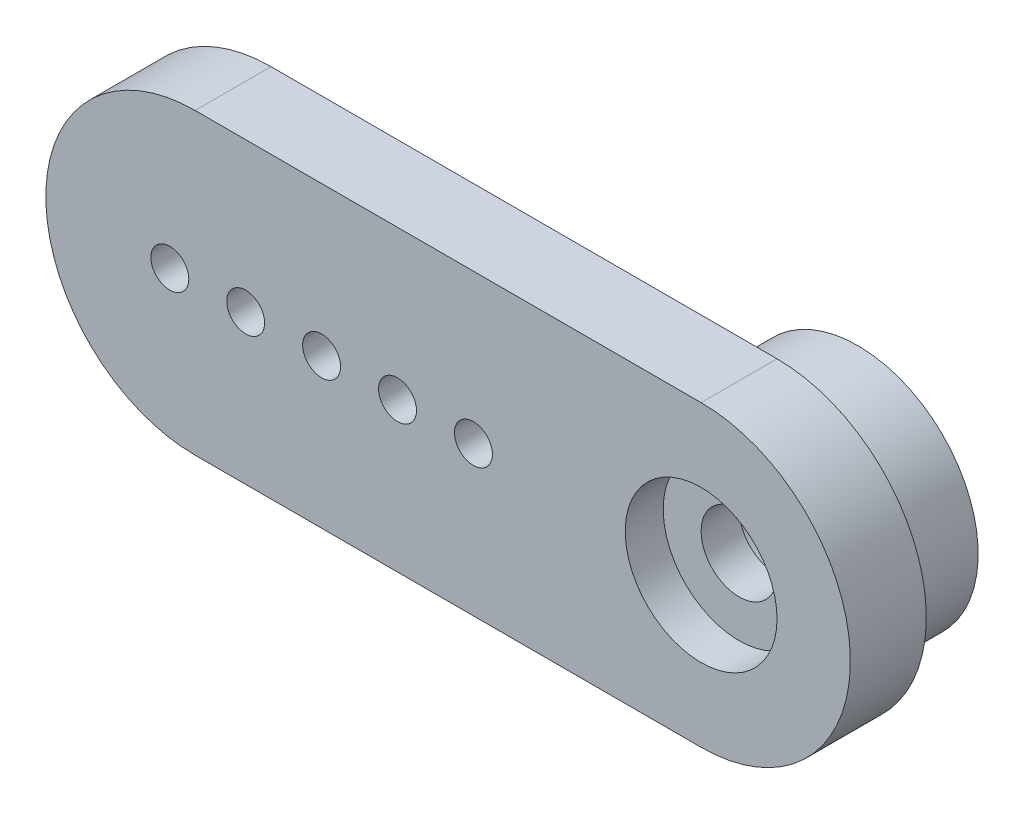
ISO-10303-21;
HEADER;
FILE_DESCRIPTION(('STEP AP214'),'2;1');
FILE_NAME('part.step','',(''),(''),'','','');
FILE_SCHEMA(('AUTOMOTIVE_DESIGN { 1 0 10303 214 1 1 1 1 }'));
ENDSEC;
DATA;
#1=APPLICATION_CONTEXT('core data for automotive mechanical design processes');
#2=APPLICATION_PROTOCOL_DEFINITION('international standard','automotive_design',2000,#1);
#3=PRODUCT_CONTEXT('',#1,'mechanical');
#4=PRODUCT('Part','Part','',(#3));
#5=PRODUCT_RELATED_PRODUCT_CATEGORY('part','',(#4));
#6=PRODUCT_DEFINITION_FORMATION('','',#4);
#7=PRODUCT_DEFINITION_CONTEXT('part definition',#1,'design');
#8=PRODUCT_DEFINITION('design','',#6,#7);
#9=PRODUCT_DEFINITION_SHAPE('','',#8);
#10=(LENGTH_UNIT() NAMED_UNIT(*) SI_UNIT(.MILLI.,.METRE.));
#11=(NAMED_UNIT(*) PLANE_ANGLE_UNIT() SI_UNIT($,.RADIAN.));
#12=(NAMED_UNIT(*) SI_UNIT($,.STERADIAN.) SOLID_ANGLE_UNIT());
#13=UNCERTAINTY_MEASURE_WITH_UNIT(LENGTH_MEASURE(1.E-05),#10,'distance_accuracy_value','');
#14=(GEOMETRIC_REPRESENTATION_CONTEXT(3) GLOBAL_UNCERTAINTY_ASSIGNED_CONTEXT((#13)) GLOBAL_UNIT_ASSIGNED_CONTEXT((#10,
#11,#12)) REPRESENTATION_CONTEXT('',''));
#15=CARTESIAN_POINT('',(0.,0.,0.));
#16=DIRECTION('',(0.,0.,1.));
#17=DIRECTION('',(1.,0.,0.));
#18=AXIS2_PLACEMENT_3D('',#15,#16,#17);
#19=CARTESIAN_POINT('',(0.,0.,-3.));
#20=DIRECTION('',(0.,0.,1.));
#21=DIRECTION('',(1.,0.,0.));
#22=AXIS2_PLACEMENT_3D('',#19,#20,#21);
#23=CYLINDRICAL_SURFACE('',#22,5.9);
#24=CARTESIAN_POINT('',(0.,0.,0.));
#25=DIRECTION('',(0.,0.,1.));
#26=DIRECTION('',(1.,0.,0.));
#27=AXIS2_PLACEMENT_3D('',#24,#25,#26);
#28=CIRCLE('',#27,5.9);
#29=CARTESIAN_POINT('',(0.,-5.9,0.));
#30=VERTEX_POINT('',#29);
#31=CARTESIAN_POINT('',(0.,5.9,0.));
#32=VERTEX_POINT('',#31);
#33=EDGE_CURVE('E100',#30,#32,#28,.T.);
#34=ORIENTED_EDGE('',*,*,#33,.F.);
#35=DIRECTION('',(0.,0.,1.));
#36=VECTOR('',#35,1.);
#37=CARTESIAN_POINT('',(0.,-5.9,-3.));
#38=LINE('',#37,#36);
#39=CARTESIAN_POINT('',(0.,-5.9,-3.));
#40=VERTEX_POINT('',#39);
#41=EDGE_CURVE('E11',#40,#30,#38,.T.);
#42=ORIENTED_EDGE('',*,*,#41,.F.);
#43=CARTESIAN_POINT('',(0.,0.,-3.));
#44=DIRECTION('',(0.,0.,1.));
#45=DIRECTION('',(1.,0.,0.));
#46=AXIS2_PLACEMENT_3D('',#43,#44,#45);
#47=CIRCLE('',#46,5.9);
#48=CARTESIAN_POINT('',(0.,5.9,-3.));
#49=VERTEX_POINT('',#48);
#50=EDGE_CURVE('E93',#40,#49,#47,.T.);
#51=ORIENTED_EDGE('',*,*,#50,.T.);
#52=DIRECTION('',(0.,0.,1.));
#53=VECTOR('',#52,1.);
#54=CARTESIAN_POINT('',(0.,5.9,-3.));
#55=LINE('',#54,#53);
#56=EDGE_CURVE('E76',#49,#32,#55,.T.);
#57=ORIENTED_EDGE('',*,*,#56,.T.);
#58=EDGE_LOOP('',(#34,#42,#51,#57));
#59=FACE_BOUND('',#58,.T.);
#60=ADVANCED_FACE('F33',(#59),#23,.T.);
#61=CARTESIAN_POINT('',(0.,-5.9,-3.));
#62=DIRECTION('',(0.,-1.,0.));
#63=DIRECTION('',(1.,0.,0.));
#64=AXIS2_PLACEMENT_3D('',#61,#62,#63);
#65=PLANE('',#64);
#66=DIRECTION('',(1.,0.,0.));
#67=VECTOR('',#66,1.);
#68=CARTESIAN_POINT('',(0.,-5.9,0.));
#69=LINE('',#68,#67);
#70=CARTESIAN_POINT('',(-20.,-5.9,0.));
#71=VERTEX_POINT('',#70);
#72=EDGE_CURVE('E95',#71,#30,#69,.T.);
#73=ORIENTED_EDGE('',*,*,#72,.F.);
#74=DIRECTION('',(0.,0.,1.));
#75=VECTOR('',#74,1.);
#76=CARTESIAN_POINT('',(-20.,-5.9,-3.));
#77=LINE('',#76,#75);
#78=CARTESIAN_POINT('',(-20.,-5.9,-3.));
#79=VERTEX_POINT('',#78);
#80=EDGE_CURVE('E42',#79,#71,#77,.T.);
#81=ORIENTED_EDGE('',*,*,#80,.F.);
#82=DIRECTION('',(1.,0.,0.));
#83=VECTOR('',#82,1.);
#84=CARTESIAN_POINT('',(0.,-5.9,-3.));
#85=LINE('',#84,#83);
#86=EDGE_CURVE('E90',#79,#40,#85,.T.);
#87=ORIENTED_EDGE('',*,*,#86,.T.);
#88=ORIENTED_EDGE('',*,*,#41,.T.);
#89=EDGE_LOOP('',(#73,#81,#87,#88));
#90=FACE_BOUND('',#89,.T.);
#91=ADVANCED_FACE('F165',(#90),#65,.T.);
#92=CARTESIAN_POINT('',(-20.,0.,-3.));
#93=DIRECTION('',(0.,0.,1.));
#94=DIRECTION('',(1.,0.,0.));
#95=AXIS2_PLACEMENT_3D('',#92,#93,#94);
#96=CYLINDRICAL_SURFACE('',#95,5.9);
#97=CARTESIAN_POINT('',(-20.,0.,0.));
#98=DIRECTION('',(0.,0.,1.));
#99=DIRECTION('',(1.,0.,0.));
#100=AXIS2_PLACEMENT_3D('',#97,#98,#99);
#101=CIRCLE('',#100,5.9);
#102=CARTESIAN_POINT('',(-20.,5.9,0.));
#103=VERTEX_POINT('',#102);
#104=EDGE_CURVE('E84',#103,#71,#101,.T.);
#105=ORIENTED_EDGE('',*,*,#104,.F.);
#106=DIRECTION('',(0.,0.,1.));
#107=VECTOR('',#106,1.);
#108=CARTESIAN_POINT('',(-20.,5.9,-3.));
#109=LINE('',#108,#107);
#110=CARTESIAN_POINT('',(-20.,5.9,-3.));
#111=VERTEX_POINT('',#110);
#112=EDGE_CURVE('E79',#111,#103,#109,.T.);
#113=ORIENTED_EDGE('',*,*,#112,.F.);
#114=CARTESIAN_POINT('',(-20.,0.,-3.));
#115=DIRECTION('',(0.,0.,1.));
#116=DIRECTION('',(1.,0.,0.));
#117=AXIS2_PLACEMENT_3D('',#114,#115,#116);
#118=CIRCLE('',#117,5.9);
#119=EDGE_CURVE('E82',#111,#79,#118,.T.);
#120=ORIENTED_EDGE('',*,*,#119,.T.);
#121=ORIENTED_EDGE('',*,*,#80,.T.);
#122=EDGE_LOOP('',(#105,#113,#120,#121));
#123=FACE_BOUND('',#122,.T.);
#124=ADVANCED_FACE('F81',(#123),#96,.T.);
#125=CARTESIAN_POINT('',(0.,5.9,-3.));
#126=DIRECTION('',(0.,1.,0.));
#127=DIRECTION('',(-1.,0.,0.));
#128=AXIS2_PLACEMENT_3D('',#125,#126,#127);
#129=PLANE('',#128);
#130=DIRECTION('',(-1.,0.,0.));
#131=VECTOR('',#130,1.);
#132=CARTESIAN_POINT('',(0.,5.9,0.));
#133=LINE('',#132,#131);
#134=EDGE_CURVE('E103',#32,#103,#133,.T.);
#135=ORIENTED_EDGE('',*,*,#134,.F.);
#136=ORIENTED_EDGE('',*,*,#56,.F.);
#137=DIRECTION('',(-1.,0.,0.));
#138=VECTOR('',#137,1.);
#139=CARTESIAN_POINT('',(0.,5.9,-3.));
#140=LINE('',#139,#138);
#141=EDGE_CURVE('E89',#49,#111,#140,.T.);
#142=ORIENTED_EDGE('',*,*,#141,.T.);
#143=ORIENTED_EDGE('',*,*,#112,.T.);
#144=EDGE_LOOP('',(#135,#136,#142,#143));
#145=FACE_BOUND('',#144,.T.);
#146=ADVANCED_FACE('F92',(#145),#129,.T.);
#147=CARTESIAN_POINT('',(0.,0.,-3.));
#148=DIRECTION('',(0.,0.,1.));
#149=DIRECTION('',(1.,0.,0.));
#150=AXIS2_PLACEMENT_3D('',#147,#148,#149);
#151=PLANE('',#150);
#152=CARTESIAN_POINT('',(0.,0.,-3.));
#153=DIRECTION('',(0.,0.,1.));
#154=DIRECTION('',(1.,0.,0.));
#155=AXIS2_PLACEMENT_3D('',#152,#153,#154);
#156=CIRCLE('',#155,4.75);
#157=CARTESIAN_POINT('',(4.75,0.,-3.));
#158=VERTEX_POINT('',#157);
#159=EDGE_CURVE('E36',#158,#158,#156,.T.);
#160=ORIENTED_EDGE('',*,*,#159,.T.);
#161=EDGE_LOOP('',(#160));
#162=FACE_BOUND('',#161,.T.);
#163=CARTESIAN_POINT('',(-8.99999999999999,0.,-3.));
#164=DIRECTION('',(0.,0.,1.));
#165=DIRECTION('',(1.,0.,0.));
#166=AXIS2_PLACEMENT_3D('',#163,#164,#165);
#167=CIRCLE('',#166,0.749999999999998);
#168=CARTESIAN_POINT('',(-8.24999999999999,0.,-3.));
#169=VERTEX_POINT('',#168);
#170=EDGE_CURVE('E127',#169,#169,#167,.T.);
#171=ORIENTED_EDGE('',*,*,#170,.T.);
#172=EDGE_LOOP('',(#171));
#173=FACE_BOUND('',#172,.T.);
#174=CARTESIAN_POINT('',(-12.,0.,-3.));
#175=DIRECTION('',(0.,0.,1.));
#176=DIRECTION('',(1.,0.,0.));
#177=AXIS2_PLACEMENT_3D('',#174,#175,#176);
#178=CIRCLE('',#177,0.749999999999998);
#179=CARTESIAN_POINT('',(-11.25,0.,-3.));
#180=VERTEX_POINT('',#179);
#181=EDGE_CURVE('E133',#180,#180,#178,.T.);
#182=ORIENTED_EDGE('',*,*,#181,.T.);
#183=EDGE_LOOP('',(#182));
#184=FACE_BOUND('',#183,.T.);
#185=CARTESIAN_POINT('',(-15.,0.,-3.));
#186=DIRECTION('',(0.,0.,1.));
#187=DIRECTION('',(1.,0.,0.));
#188=AXIS2_PLACEMENT_3D('',#185,#186,#187);
#189=CIRCLE('',#188,0.749999999999998);
#190=CARTESIAN_POINT('',(-14.25,0.,-3.));
#191=VERTEX_POINT('',#190);
#192=EDGE_CURVE('E139',#191,#191,#189,.T.);
#193=ORIENTED_EDGE('',*,*,#192,.T.);
#194=EDGE_LOOP('',(#193));
#195=FACE_BOUND('',#194,.T.);
#196=CARTESIAN_POINT('',(-18.,0.,-3.));
#197=DIRECTION('',(0.,0.,1.));
#198=DIRECTION('',(1.,0.,0.));
#199=AXIS2_PLACEMENT_3D('',#196,#197,#198);
#200=CIRCLE('',#199,0.750000000000013);
#201=CARTESIAN_POINT('',(-17.25,0.,-3.));
#202=VERTEX_POINT('',#201);
#203=EDGE_CURVE('E145',#202,#202,#200,.T.);
#204=ORIENTED_EDGE('',*,*,#203,.T.);
#205=EDGE_LOOP('',(#204));
#206=FACE_BOUND('',#205,.T.);
#207=CARTESIAN_POINT('',(-21.,0.,-3.));
#208=DIRECTION('',(0.,0.,1.));
#209=DIRECTION('',(1.,0.,0.));
#210=AXIS2_PLACEMENT_3D('',#207,#208,#209);
#211=CIRCLE('',#210,0.750000000000013);
#212=CARTESIAN_POINT('',(-20.25,0.,-3.));
#213=VERTEX_POINT('',#212);
#214=EDGE_CURVE('E151',#213,#213,#211,.T.);
#215=ORIENTED_EDGE('',*,*,#214,.T.);
#216=EDGE_LOOP('',(#215));
#217=FACE_BOUND('',#216,.T.);
#218=ORIENTED_EDGE('',*,*,#50,.F.);
#219=ORIENTED_EDGE('',*,*,#86,.F.);
#220=ORIENTED_EDGE('',*,*,#119,.F.);
#221=ORIENTED_EDGE('',*,*,#141,.F.);
#222=EDGE_LOOP('',(#218,#219,#220,#221));
#223=FACE_BOUND('',#222,.T.);
#224=ADVANCED_FACE('F88',(#162,#173,#184,#195,#206,#217,#223),#151,.F.);
#225=CARTESIAN_POINT('',(0.,0.,0.));
#226=DIRECTION('',(0.,0.,1.));
#227=DIRECTION('',(1.,0.,0.));
#228=AXIS2_PLACEMENT_3D('',#225,#226,#227);
#229=PLANE('',#228);
#230=CARTESIAN_POINT('',(-8.99999999999999,0.,0.));
#231=DIRECTION('',(0.,0.,1.));
#232=DIRECTION('',(1.,0.,0.));
#233=AXIS2_PLACEMENT_3D('',#230,#231,#232);
#234=CIRCLE('',#233,0.749999999999998);
#235=CARTESIAN_POINT('',(-8.24999999999999,0.,0.));
#236=VERTEX_POINT('',#235);
#237=EDGE_CURVE('E116',#236,#236,#234,.T.);
#238=ORIENTED_EDGE('',*,*,#237,.F.);
#239=EDGE_LOOP('',(#238));
#240=FACE_BOUND('',#239,.T.);
#241=CARTESIAN_POINT('',(-12.,0.,0.));
#242=DIRECTION('',(0.,0.,1.));
#243=DIRECTION('',(1.,0.,0.));
#244=AXIS2_PLACEMENT_3D('',#241,#242,#243);
#245=CIRCLE('',#244,0.749999999999998);
#246=CARTESIAN_POINT('',(-11.25,0.,0.));
#247=VERTEX_POINT('',#246);
#248=EDGE_CURVE('E130',#247,#247,#245,.T.);
#249=ORIENTED_EDGE('',*,*,#248,.F.);
#250=EDGE_LOOP('',(#249));
#251=FACE_BOUND('',#250,.T.);
#252=CARTESIAN_POINT('',(-15.,0.,0.));
#253=DIRECTION('',(0.,0.,1.));
#254=DIRECTION('',(1.,0.,0.));
#255=AXIS2_PLACEMENT_3D('',#252,#253,#254);
#256=CIRCLE('',#255,0.749999999999998);
#257=CARTESIAN_POINT('',(-14.25,0.,0.));
#258=VERTEX_POINT('',#257);
#259=EDGE_CURVE('E136',#258,#258,#256,.T.);
#260=ORIENTED_EDGE('',*,*,#259,.F.);
#261=EDGE_LOOP('',(#260));
#262=FACE_BOUND('',#261,.T.);
#263=CARTESIAN_POINT('',(-18.,0.,0.));
#264=DIRECTION('',(0.,0.,1.));
#265=DIRECTION('',(1.,0.,0.));
#266=AXIS2_PLACEMENT_3D('',#263,#264,#265);
#267=CIRCLE('',#266,0.750000000000013);
#268=CARTESIAN_POINT('',(-17.25,0.,0.));
#269=VERTEX_POINT('',#268);
#270=EDGE_CURVE('E142',#269,#269,#267,.T.);
#271=ORIENTED_EDGE('',*,*,#270,.F.);
#272=EDGE_LOOP('',(#271));
#273=FACE_BOUND('',#272,.T.);
#274=CARTESIAN_POINT('',(-21.,0.,0.));
#275=DIRECTION('',(0.,0.,1.));
#276=DIRECTION('',(1.,0.,0.));
#277=AXIS2_PLACEMENT_3D('',#274,#275,#276);
#278=CIRCLE('',#277,0.750000000000013);
#279=CARTESIAN_POINT('',(-20.25,0.,0.));
#280=VERTEX_POINT('',#279);
#281=EDGE_CURVE('E148',#280,#280,#278,.T.);
#282=ORIENTED_EDGE('',*,*,#281,.F.);
#283=EDGE_LOOP('',(#282));
#284=FACE_BOUND('',#283,.T.);
#285=CARTESIAN_POINT('',(0.,0.,0.));
#286=DIRECTION('',(0.,0.,1.));
#287=DIRECTION('',(1.,0.,0.));
#288=AXIS2_PLACEMENT_3D('',#285,#286,#287);
#289=CIRCLE('',#288,3.);
#290=CARTESIAN_POINT('',(3.,0.,0.));
#291=VERTEX_POINT('',#290);
#292=EDGE_CURVE('E104',#291,#291,#289,.T.);
#293=ORIENTED_EDGE('',*,*,#292,.F.);
#294=EDGE_LOOP('',(#293));
#295=FACE_BOUND('',#294,.T.);
#296=ORIENTED_EDGE('',*,*,#33,.T.);
#297=ORIENTED_EDGE('',*,*,#134,.T.);
#298=ORIENTED_EDGE('',*,*,#104,.T.);
#299=ORIENTED_EDGE('',*,*,#72,.T.);
#300=EDGE_LOOP('',(#296,#297,#298,#299));
#301=FACE_BOUND('',#300,.T.);
#302=ADVANCED_FACE('F160',(#240,#251,#262,#273,#284,#295,#301),#229,.T.);
#303=CARTESIAN_POINT('',(0.,0.,-3.));
#304=DIRECTION('',(0.,0.,1.));
#305=DIRECTION('',(1.,0.,0.));
#306=AXIS2_PLACEMENT_3D('',#303,#304,#305);
#307=CYLINDRICAL_SURFACE('',#306,3.);
#308=CARTESIAN_POINT('',(0.,0.,-1.5));
#309=DIRECTION('',(0.,0.,1.));
#310=DIRECTION('',(1.,0.,0.));
#311=AXIS2_PLACEMENT_3D('',#308,#309,#310);
#312=CIRCLE('',#311,3.);
#313=CARTESIAN_POINT('',(3.,0.,-1.5));
#314=VERTEX_POINT('',#313);
#315=EDGE_CURVE('E110',#314,#314,#312,.F.);
#316=ORIENTED_EDGE('',*,*,#315,.T.);
#317=EDGE_LOOP('',(#316));
#318=FACE_BOUND('',#317,.T.);
#319=ORIENTED_EDGE('',*,*,#292,.T.);
#320=EDGE_LOOP('',(#319));
#321=FACE_BOUND('',#320,.T.);
#322=ADVANCED_FACE('F158',(#318,#321),#307,.F.);
#323=CARTESIAN_POINT('',(-21.,0.,-3.));
#324=DIRECTION('',(0.,0.,1.));
#325=DIRECTION('',(1.,0.,0.));
#326=AXIS2_PLACEMENT_3D('',#323,#324,#325);
#327=CYLINDRICAL_SURFACE('',#326,0.750000000000013);
#328=ORIENTED_EDGE('',*,*,#214,.F.);
#329=EDGE_LOOP('',(#328));
#330=FACE_BOUND('',#329,.T.);
#331=ORIENTED_EDGE('',*,*,#281,.T.);
#332=EDGE_LOOP('',(#331));
#333=FACE_BOUND('',#332,.T.);
#334=ADVANCED_FACE('F185',(#330,#333),#327,.F.);
#335=CARTESIAN_POINT('',(-18.,0.,-3.));
#336=DIRECTION('',(0.,0.,1.));
#337=DIRECTION('',(1.,0.,0.));
#338=AXIS2_PLACEMENT_3D('',#335,#336,#337);
#339=CYLINDRICAL_SURFACE('',#338,0.750000000000013);
#340=ORIENTED_EDGE('',*,*,#203,.F.);
#341=EDGE_LOOP('',(#340));
#342=FACE_BOUND('',#341,.T.);
#343=ORIENTED_EDGE('',*,*,#270,.T.);
#344=EDGE_LOOP('',(#343));
#345=FACE_BOUND('',#344,.T.);
#346=ADVANCED_FACE('F188',(#342,#345),#339,.F.);
#347=CARTESIAN_POINT('',(-15.,0.,-3.));
#348=DIRECTION('',(0.,0.,1.));
#349=DIRECTION('',(1.,0.,0.));
#350=AXIS2_PLACEMENT_3D('',#347,#348,#349);
#351=CYLINDRICAL_SURFACE('',#350,0.749999999999998);
#352=ORIENTED_EDGE('',*,*,#192,.F.);
#353=EDGE_LOOP('',(#352));
#354=FACE_BOUND('',#353,.T.);
#355=ORIENTED_EDGE('',*,*,#259,.T.);
#356=EDGE_LOOP('',(#355));
#357=FACE_BOUND('',#356,.T.);
#358=ADVANCED_FACE('F192',(#354,#357),#351,.F.);
#359=CARTESIAN_POINT('',(-12.,0.,-3.));
#360=DIRECTION('',(0.,0.,1.));
#361=DIRECTION('',(1.,0.,0.));
#362=AXIS2_PLACEMENT_3D('',#359,#360,#361);
#363=CYLINDRICAL_SURFACE('',#362,0.749999999999998);
#364=ORIENTED_EDGE('',*,*,#181,.F.);
#365=EDGE_LOOP('',(#364));
#366=FACE_BOUND('',#365,.T.);
#367=ORIENTED_EDGE('',*,*,#248,.T.);
#368=EDGE_LOOP('',(#367));
#369=FACE_BOUND('',#368,.T.);
#370=ADVANCED_FACE('F196',(#366,#369),#363,.F.);
#371=CARTESIAN_POINT('',(-8.99999999999999,0.,-3.));
#372=DIRECTION('',(0.,0.,1.));
#373=DIRECTION('',(1.,0.,0.));
#374=AXIS2_PLACEMENT_3D('',#371,#372,#373);
#375=CYLINDRICAL_SURFACE('',#374,0.749999999999998);
#376=ORIENTED_EDGE('',*,*,#170,.F.);
#377=EDGE_LOOP('',(#376));
#378=FACE_BOUND('',#377,.T.);
#379=ORIENTED_EDGE('',*,*,#237,.T.);
#380=EDGE_LOOP('',(#379));
#381=FACE_BOUND('',#380,.T.);
#382=ADVANCED_FACE('F200',(#378,#381),#375,.F.);
#383=CARTESIAN_POINT('',(0.,0.,-6.2));
#384=DIRECTION('',(0.,0.,-1.));
#385=DIRECTION('',(-1.,0.,0.));
#386=AXIS2_PLACEMENT_3D('',#383,#384,#385);
#387=CYLINDRICAL_SURFACE('',#386,4.75);
#388=CARTESIAN_POINT('',(0.,0.,-6.2));
#389=DIRECTION('',(0.,0.,-1.));
#390=DIRECTION('',(-1.,0.,0.));
#391=AXIS2_PLACEMENT_3D('',#388,#389,#390);
#392=CIRCLE('',#391,4.75);
#393=CARTESIAN_POINT('',(-4.75,0.,-6.2));
#394=VERTEX_POINT('',#393);
#395=EDGE_CURVE('E232',#394,#394,#392,.T.);
#396=ORIENTED_EDGE('',*,*,#395,.F.);
#397=EDGE_LOOP('',(#396));
#398=FACE_BOUND('',#397,.T.);
#399=ORIENTED_EDGE('',*,*,#159,.F.);
#400=EDGE_LOOP('',(#399));
#401=FACE_BOUND('',#400,.T.);
#402=ADVANCED_FACE('F204',(#398,#401),#387,.T.);
#403=CARTESIAN_POINT('',(-4.75,0.,-1.5));
#404=DIRECTION('',(0.,0.,1.));
#405=DIRECTION('',(1.,0.,0.));
#406=AXIS2_PLACEMENT_3D('',#403,#404,#405);
#407=PLANE('',#406);
#408=CARTESIAN_POINT('',(0.,0.,-1.5));
#409=DIRECTION('',(0.,0.,-1.));
#410=DIRECTION('',(-1.,0.,0.));
#411=AXIS2_PLACEMENT_3D('',#408,#409,#410);
#412=CIRCLE('',#411,1.5);
#413=CARTESIAN_POINT('',(-1.5,0.,-1.5));
#414=VERTEX_POINT('',#413);
#415=EDGE_CURVE('E112',#414,#414,#412,.T.);
#416=ORIENTED_EDGE('',*,*,#415,.T.);
#417=EDGE_LOOP('',(#416));
#418=FACE_BOUND('',#417,.T.);
#419=ORIENTED_EDGE('',*,*,#315,.F.);
#420=EDGE_LOOP('',(#419));
#421=FACE_BOUND('',#420,.T.);
#422=ADVANCED_FACE('F208',(#418,#421),#407,.T.);
#423=CARTESIAN_POINT('',(0.,0.,-6.2));
#424=DIRECTION('',(0.,0.,-1.));
#425=DIRECTION('',(-1.,0.,0.));
#426=AXIS2_PLACEMENT_3D('',#423,#424,#425);
#427=CYLINDRICAL_SURFACE('',#426,1.5);
#428=CARTESIAN_POINT('',(0.,0.,-3.));
#429=DIRECTION('',(0.,0.,-1.));
#430=DIRECTION('',(-1.,0.,0.));
#431=AXIS2_PLACEMENT_3D('',#428,#429,#430);
#432=CIRCLE('',#431,1.5);
#433=CARTESIAN_POINT('',(-1.5,0.,-3.));
#434=VERTEX_POINT('',#433);
#435=EDGE_CURVE('E118',#434,#434,#432,.T.);
#436=ORIENTED_EDGE('',*,*,#435,.T.);
#437=EDGE_LOOP('',(#436));
#438=FACE_BOUND('',#437,.T.);
#439=ORIENTED_EDGE('',*,*,#415,.F.);
#440=EDGE_LOOP('',(#439));
#441=FACE_BOUND('',#440,.T.);
#442=ADVANCED_FACE('F212',(#438,#441),#427,.F.);
#443=CARTESIAN_POINT('',(-1.5,0.,-3.));
#444=DIRECTION('',(0.,0.,-1.));
#445=DIRECTION('',(-1.,0.,0.));
#446=AXIS2_PLACEMENT_3D('',#443,#444,#445);
#447=PLANE('',#446);
#448=CARTESIAN_POINT('',(0.,0.,-3.));
#449=DIRECTION('',(0.,0.,-1.));
#450=DIRECTION('',(-1.,0.,0.));
#451=AXIS2_PLACEMENT_3D('',#448,#449,#450);
#452=CIRCLE('',#451,2.75);
#453=CARTESIAN_POINT('',(-2.75,0.,-3.));
#454=VERTEX_POINT('',#453);
#455=EDGE_CURVE('E123',#454,#454,#452,.T.);
#456=ORIENTED_EDGE('',*,*,#455,.T.);
#457=EDGE_LOOP('',(#456));
#458=FACE_BOUND('',#457,.T.);
#459=ORIENTED_EDGE('',*,*,#435,.F.);
#460=EDGE_LOOP('',(#459));
#461=FACE_BOUND('',#460,.T.);
#462=ADVANCED_FACE('F215',(#458,#461),#447,.T.);
#463=CARTESIAN_POINT('',(0.,0.,-6.2));
#464=DIRECTION('',(0.,0.,-1.));
#465=DIRECTION('',(-1.,0.,0.));
#466=AXIS2_PLACEMENT_3D('',#463,#464,#465);
#467=CYLINDRICAL_SURFACE('',#466,2.75);
#468=CARTESIAN_POINT('',(0.,0.,-6.2));
#469=DIRECTION('',(0.,0.,-1.));
#470=DIRECTION('',(-1.,0.,0.));
#471=AXIS2_PLACEMENT_3D('',#468,#469,#470);
#472=CIRCLE('',#471,2.75);
#473=CARTESIAN_POINT('',(-2.75,0.,-6.2));
#474=VERTEX_POINT('',#473);
#475=EDGE_CURVE('E235',#474,#474,#472,.T.);
#476=ORIENTED_EDGE('',*,*,#475,.T.);
#477=EDGE_LOOP('',(#476));
#478=FACE_BOUND('',#477,.T.);
#479=ORIENTED_EDGE('',*,*,#455,.F.);
#480=EDGE_LOOP('',(#479));
#481=FACE_BOUND('',#480,.T.);
#482=ADVANCED_FACE('F219',(#478,#481),#467,.F.);
#483=CARTESIAN_POINT('',(-4.75,0.,-6.2));
#484=DIRECTION('',(0.,0.,-1.));
#485=DIRECTION('',(-1.,0.,0.));
#486=AXIS2_PLACEMENT_3D('',#483,#484,#485);
#487=PLANE('',#486);
#488=ORIENTED_EDGE('',*,*,#395,.T.);
#489=EDGE_LOOP('',(#488));
#490=FACE_BOUND('',#489,.T.);
#491=ORIENTED_EDGE('',*,*,#475,.F.);
#492=EDGE_LOOP('',(#491));
#493=FACE_BOUND('',#492,.T.);
#494=ADVANCED_FACE('F223',(#490,#493),#487,.T.);
#495=CLOSED_SHELL('',(#60,#91,#124,#146,#224,#302,#322,#334,#346,#358,#370,#382,#402,#422,#442,
#462,#482,#494));
#496=MANIFOLD_SOLID_BREP('B2',#495);
#497=ADVANCED_BREP_SHAPE_REPRESENTATION('',(#18,#496),#14);
#498=SHAPE_DEFINITION_REPRESENTATION(#9,#497);
ENDSEC;
END-ISO-10303-21;
